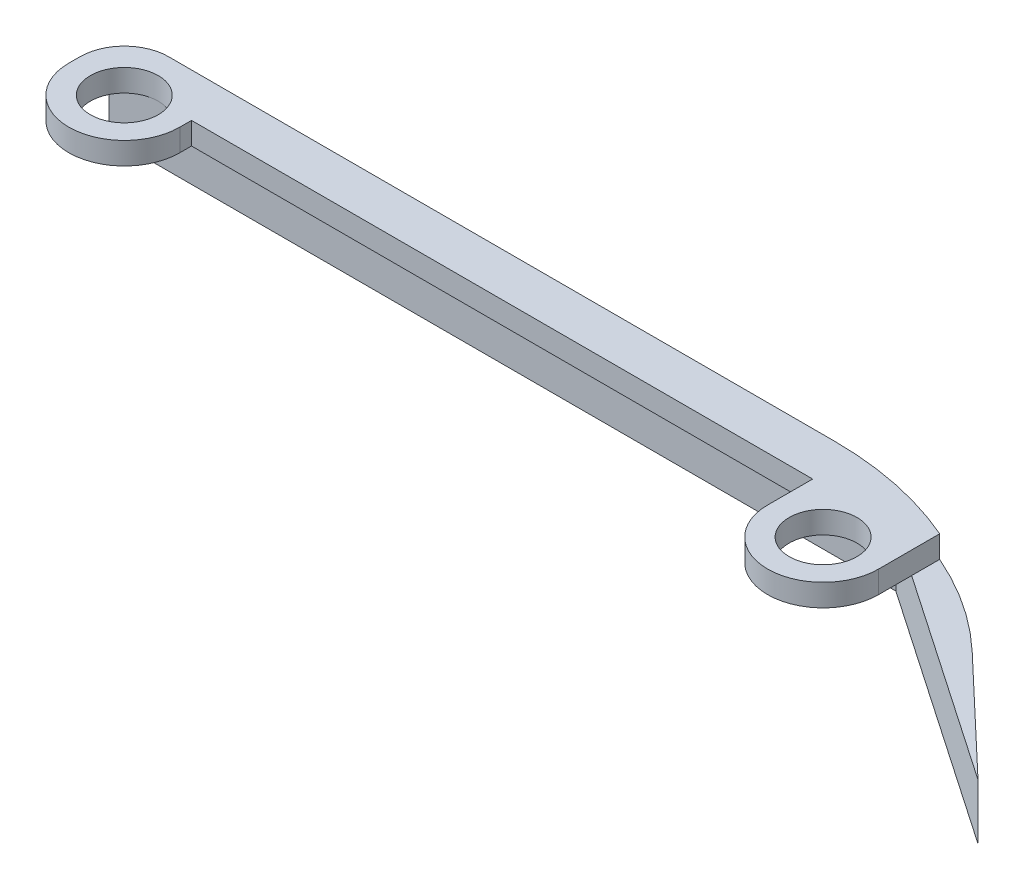
ISO-10303-21;
HEADER;
FILE_DESCRIPTION(('STEP AP214'),'2;1');
FILE_NAME('part.step','',(''),(''),'','','');
FILE_SCHEMA(('AUTOMOTIVE_DESIGN { 1 0 10303 214 1 1 1 1 }'));
ENDSEC;
DATA;
#1=APPLICATION_CONTEXT('core data for automotive mechanical design processes');
#2=APPLICATION_PROTOCOL_DEFINITION('international standard','automotive_design',2000,#1);
#3=PRODUCT_CONTEXT('',#1,'mechanical');
#4=PRODUCT('Part','Part','',(#3));
#5=PRODUCT_RELATED_PRODUCT_CATEGORY('part','',(#4));
#6=PRODUCT_DEFINITION_FORMATION('','',#4);
#7=PRODUCT_DEFINITION_CONTEXT('part definition',#1,'design');
#8=PRODUCT_DEFINITION('design','',#6,#7);
#9=PRODUCT_DEFINITION_SHAPE('','',#8);
#10=(LENGTH_UNIT() NAMED_UNIT(*) SI_UNIT(.MILLI.,.METRE.));
#11=(NAMED_UNIT(*) PLANE_ANGLE_UNIT() SI_UNIT($,.RADIAN.));
#12=(NAMED_UNIT(*) SI_UNIT($,.STERADIAN.) SOLID_ANGLE_UNIT());
#13=UNCERTAINTY_MEASURE_WITH_UNIT(LENGTH_MEASURE(1.E-05),#10,'distance_accuracy_value','');
#14=(GEOMETRIC_REPRESENTATION_CONTEXT(3) GLOBAL_UNCERTAINTY_ASSIGNED_CONTEXT((#13)) GLOBAL_UNIT_ASSIGNED_CONTEXT((#10,
#11,#12)) REPRESENTATION_CONTEXT('',''));
#15=CARTESIAN_POINT('',(0.,0.,0.));
#16=DIRECTION('',(0.,0.,1.));
#17=DIRECTION('',(1.,0.,0.));
#18=AXIS2_PLACEMENT_3D('',#15,#16,#17);
#19=CARTESIAN_POINT('',(-1.,2.,-1.));
#20=DIRECTION('',(0.,1.,0.));
#21=DIRECTION('',(0.,0.,1.));
#22=AXIS2_PLACEMENT_3D('',#19,#20,#21);
#23=CYLINDRICAL_SURFACE('',#22,4.);
#24=DIRECTION('',(0.,1.,0.));
#25=VECTOR('',#24,1.);
#26=CARTESIAN_POINT('',(-1.,2.,-5.));
#27=LINE('',#26,#25);
#28=CARTESIAN_POINT('',(-1.,-5.,-5.));
#29=VERTEX_POINT('',#28);
#30=CARTESIAN_POINT('',(-1.,2.,-5.));
#31=VERTEX_POINT('',#30);
#32=EDGE_CURVE('E257',#29,#31,#27,.T.);
#33=ORIENTED_EDGE('',*,*,#32,.F.);
#34=CARTESIAN_POINT('',(-1.,-5.,-1.));
#35=DIRECTION('',(0.,-1.,0.));
#36=DIRECTION('',(0.,0.,-1.));
#37=AXIS2_PLACEMENT_3D('',#34,#35,#36);
#38=CIRCLE('',#37,4.);
#39=CARTESIAN_POINT('',(-4.42876070906093,-5.,-3.06));
#40=VERTEX_POINT('',#39);
#41=EDGE_CURVE('E42',#40,#29,#38,.T.);
#42=ORIENTED_EDGE('',*,*,#41,.F.);
#43=DIRECTION('',(0.,1.,0.));
#44=VECTOR('',#43,1.);
#45=CARTESIAN_POINT('',(-4.42876070906093,2.,-3.06));
#46=LINE('',#45,#44);
#47=CARTESIAN_POINT('',(-4.42876070906093,0.,-3.06));
#48=VERTEX_POINT('',#47);
#49=EDGE_CURVE('E52',#48,#40,#46,.F.);
#50=ORIENTED_EDGE('',*,*,#49,.F.);
#51=CARTESIAN_POINT('',(-1.,0.,-1.));
#52=DIRECTION('',(0.,1.,0.));
#53=DIRECTION('',(0.,0.,1.));
#54=AXIS2_PLACEMENT_3D('',#51,#52,#53);
#55=CIRCLE('',#54,4.);
#56=CARTESIAN_POINT('',(-5.,0.,-1.));
#57=VERTEX_POINT('',#56);
#58=EDGE_CURVE('E263',#57,#48,#55,.F.);
#59=ORIENTED_EDGE('',*,*,#58,.F.);
#60=DIRECTION('',(0.,1.,0.));
#61=VECTOR('',#60,1.);
#62=CARTESIAN_POINT('',(-5.,2.,-1.));
#63=LINE('',#62,#61);
#64=CARTESIAN_POINT('',(-5.,2.,-1.));
#65=VERTEX_POINT('',#64);
#66=EDGE_CURVE('E260',#65,#57,#63,.F.);
#67=ORIENTED_EDGE('',*,*,#66,.F.);
#68=CARTESIAN_POINT('',(-1.,2.,-1.));
#69=DIRECTION('',(0.,1.,0.));
#70=DIRECTION('',(0.,0.,1.));
#71=AXIS2_PLACEMENT_3D('',#68,#69,#70);
#72=CIRCLE('',#71,4.);
#73=EDGE_CURVE('E11',#31,#65,#72,.T.);
#74=ORIENTED_EDGE('',*,*,#73,.F.);
#75=EDGE_LOOP('',(#33,#42,#50,#59,#67,#74));
#76=FACE_BOUND('',#75,.T.);
#77=ADVANCED_FACE('F35',(#76),#23,.T.);
#78=CARTESIAN_POINT('',(59.030327127602,-5.,25.));
#79=DIRECTION('',(0.,1.,0.));
#80=DIRECTION('',(0.,0.,1.));
#81=AXIS2_PLACEMENT_3D('',#78,#79,#80);
#82=CYLINDRICAL_SURFACE('',#81,30.);
#83=DIRECTION('',(0.,1.,0.));
#84=VECTOR('',#83,1.);
#85=CARTESIAN_POINT('',(79.682073844056,-5.,3.23982174798584));
#86=LINE('',#85,#84);
#87=CARTESIAN_POINT('',(79.682073844056,-5.,3.23982174798584));
#88=VERTEX_POINT('',#87);
#89=CARTESIAN_POINT('',(79.682073844056,0.,3.23982174798584));
#90=VERTEX_POINT('',#89);
#91=EDGE_CURVE('E183',#88,#90,#86,.T.);
#92=ORIENTED_EDGE('',*,*,#91,.F.);
#93=CARTESIAN_POINT('',(59.030327127602,-5.,25.));
#94=DIRECTION('',(0.,-1.,0.));
#95=DIRECTION('',(0.,0.,-1.));
#96=AXIS2_PLACEMENT_3D('',#93,#94,#95);
#97=CIRCLE('',#96,30.);
#98=CARTESIAN_POINT('',(59.030327127602,-5.,-5.));
#99=VERTEX_POINT('',#98);
#100=EDGE_CURVE('E255',#99,#88,#97,.T.);
#101=ORIENTED_EDGE('',*,*,#100,.F.);
#102=DIRECTION('',(0.,1.,0.));
#103=VECTOR('',#102,1.);
#104=CARTESIAN_POINT('',(59.030327127602,2.,-5.));
#105=LINE('',#104,#103);
#106=CARTESIAN_POINT('',(59.030327127602,2.,-5.));
#107=VERTEX_POINT('',#106);
#108=EDGE_CURVE('E252',#107,#99,#105,.F.);
#109=ORIENTED_EDGE('',*,*,#108,.F.);
#110=CARTESIAN_POINT('',(59.030327127602,2.,25.));
#111=DIRECTION('',(0.,1.,0.));
#112=DIRECTION('',(0.,0.,1.));
#113=AXIS2_PLACEMENT_3D('',#110,#111,#112);
#114=CIRCLE('',#113,30.);
#115=CARTESIAN_POINT('',(71.,2.,-2.50867011194432));
#116=VERTEX_POINT('',#115);
#117=EDGE_CURVE('E249',#116,#107,#114,.T.);
#118=ORIENTED_EDGE('',*,*,#117,.F.);
#119=DIRECTION('',(0.,1.,0.));
#120=VECTOR('',#119,1.);
#121=CARTESIAN_POINT('',(71.,-5.,-2.50867011194431));
#122=LINE('',#121,#120);
#123=CARTESIAN_POINT('',(71.,0.,-2.50867011194431));
#124=VERTEX_POINT('',#123);
#125=EDGE_CURVE('E246',#124,#116,#122,.T.);
#126=ORIENTED_EDGE('',*,*,#125,.F.);
#127=CARTESIAN_POINT('',(59.030327127602,0.,25.));
#128=DIRECTION('',(0.,-1.,0.));
#129=DIRECTION('',(0.,0.,-1.));
#130=AXIS2_PLACEMENT_3D('',#127,#128,#129);
#131=CIRCLE('',#130,30.);
#132=EDGE_CURVE('E243',#90,#124,#131,.F.);
#133=ORIENTED_EDGE('',*,*,#132,.F.);
#134=EDGE_LOOP('',(#92,#101,#109,#118,#126,#133));
#135=FACE_BOUND('',#134,.T.);
#136=ADVANCED_FACE('F276',(#135),#82,.T.);
#137=CARTESIAN_POINT('',(5.,2.,-3.06));
#138=DIRECTION('',(0.,0.,-1.));
#139=DIRECTION('',(-1.,0.,0.));
#140=AXIS2_PLACEMENT_3D('',#137,#138,#139);
#141=PLANE('',#140);
#142=DIRECTION('',(-1.,0.,0.));
#143=VECTOR('',#142,1.);
#144=CARTESIAN_POINT('',(66.5,0.,-3.06));
#145=LINE('',#144,#143);
#146=CARTESIAN_POINT('',(0.,0.,-3.06));
#147=VERTEX_POINT('',#146);
#148=EDGE_CURVE('E184',#147,#48,#145,.T.);
#149=ORIENTED_EDGE('',*,*,#148,.T.);
#150=ORIENTED_EDGE('',*,*,#49,.T.);
#151=DIRECTION('',(-1.,0.,0.));
#152=VECTOR('',#151,1.);
#153=CARTESIAN_POINT('',(66.5,-5.,-3.06));
#154=LINE('',#153,#152);
#155=CARTESIAN_POINT('',(66.5,-5.,-3.06));
#156=VERTEX_POINT('',#155);
#157=EDGE_CURVE('E173',#156,#40,#154,.T.);
#158=ORIENTED_EDGE('',*,*,#157,.F.);
#159=DIRECTION('',(0.,1.,0.));
#160=VECTOR('',#159,1.);
#161=CARTESIAN_POINT('',(66.5,-5.,-3.06));
#162=LINE('',#161,#160);
#163=CARTESIAN_POINT('',(66.5,0.,-3.06));
#164=VERTEX_POINT('',#163);
#165=EDGE_CURVE('E175',#156,#164,#162,.T.);
#166=ORIENTED_EDGE('',*,*,#165,.T.);
#167=EDGE_CURVE('E180',#164,#147,#145,.T.);
#168=ORIENTED_EDGE('',*,*,#167,.T.);
#169=EDGE_LOOP('',(#149,#150,#158,#166,#168));
#170=FACE_BOUND('',#169,.T.);
#171=ADVANCED_FACE('F302',(#170),#141,.F.);
#172=CARTESIAN_POINT('',(0.,0.,0.));
#173=DIRECTION('',(0.,1.,0.));
#174=DIRECTION('',(0.,0.,1.));
#175=AXIS2_PLACEMENT_3D('',#172,#173,#174);
#176=PLANE('',#175);
#177=CARTESIAN_POINT('',(66.,0.,3.));
#178=DIRECTION('',(0.,1.,0.));
#179=DIRECTION('',(0.,0.,1.));
#180=AXIS2_PLACEMENT_3D('',#177,#178,#179);
#181=CIRCLE('',#180,3.06);
#182=CARTESIAN_POINT('',(66.,0.,6.06));
#183=VERTEX_POINT('',#182);
#184=EDGE_CURVE('E190',#183,#183,#181,.T.);
#185=ORIENTED_EDGE('',*,*,#184,.T.);
#186=EDGE_LOOP('',(#185));
#187=FACE_BOUND('',#186,.T.);
#188=DIRECTION('',(0.,0.,1.));
#189=VECTOR('',#188,1.);
#190=CARTESIAN_POINT('',(-5.,0.,0.));
#191=LINE('',#190,#189);
#192=CARTESIAN_POINT('',(-5.,0.,0.));
#193=VERTEX_POINT('',#192);
#194=EDGE_CURVE('E207',#57,#193,#191,.T.);
#195=ORIENTED_EDGE('',*,*,#194,.F.);
#196=ORIENTED_EDGE('',*,*,#58,.T.);
#197=ORIENTED_EDGE('',*,*,#148,.F.);
#198=CARTESIAN_POINT('',(0.,0.,0.));
#199=DIRECTION('',(0.,1.,0.));
#200=DIRECTION('',(0.,0.,1.));
#201=AXIS2_PLACEMENT_3D('',#198,#199,#200);
#202=CIRCLE('',#201,3.06);
#203=EDGE_CURVE('E194',#147,#147,#202,.T.);
#204=ORIENTED_EDGE('',*,*,#203,.T.);
#205=ORIENTED_EDGE('',*,*,#167,.F.);
#206=DIRECTION('',(-0.825380372116216,0.,-0.564577046403143));
#207=VECTOR('',#206,1.);
#208=CARTESIAN_POINT('',(89.9332649686347,0.,12.968832245736));
#209=LINE('',#208,#207);
#210=CARTESIAN_POINT('',(71.,0.,0.0180919860018455));
#211=VERTEX_POINT('',#210);
#212=EDGE_CURVE('E179',#211,#164,#209,.T.);
#213=ORIENTED_EDGE('',*,*,#212,.F.);
#214=DIRECTION('',(0.,0.,-1.));
#215=VECTOR('',#214,1.);
#216=CARTESIAN_POINT('',(71.,0.,3.));
#217=LINE('',#216,#215);
#218=CARTESIAN_POINT('',(71.,0.,3.));
#219=VERTEX_POINT('',#218);
#220=EDGE_CURVE('E227',#219,#211,#217,.T.);
#221=ORIENTED_EDGE('',*,*,#220,.F.);
#222=CARTESIAN_POINT('',(66.,0.,3.));
#223=DIRECTION('',(0.,1.,0.));
#224=DIRECTION('',(0.,0.,1.));
#225=AXIS2_PLACEMENT_3D('',#222,#223,#224);
#226=CIRCLE('',#225,5.);
#227=CARTESIAN_POINT('',(61.,0.,3.));
#228=VERTEX_POINT('',#227);
#229=EDGE_CURVE('E145',#228,#219,#226,.T.);
#230=ORIENTED_EDGE('',*,*,#229,.F.);
#231=DIRECTION('',(0.,0.,1.));
#232=VECTOR('',#231,1.);
#233=CARTESIAN_POINT('',(61.,0.,3.));
#234=LINE('',#233,#232);
#235=CARTESIAN_POINT('',(61.,0.,-1.06));
#236=VERTEX_POINT('',#235);
#237=EDGE_CURVE('E137',#236,#228,#234,.T.);
#238=ORIENTED_EDGE('',*,*,#237,.F.);
#239=DIRECTION('',(-1.,0.,0.));
#240=VECTOR('',#239,1.);
#241=CARTESIAN_POINT('',(5.,0.,-1.06));
#242=LINE('',#241,#240);
#243=CARTESIAN_POINT('',(5.,0.,-1.06));
#244=VERTEX_POINT('',#243);
#245=EDGE_CURVE('E142',#236,#244,#242,.T.);
#246=ORIENTED_EDGE('',*,*,#245,.T.);
#247=DIRECTION('',(0.,0.,-1.));
#248=VECTOR('',#247,1.);
#249=CARTESIAN_POINT('',(5.,0.,0.));
#250=LINE('',#249,#248);
#251=CARTESIAN_POINT('',(5.,0.,0.));
#252=VERTEX_POINT('',#251);
#253=EDGE_CURVE('E149',#252,#244,#250,.T.);
#254=ORIENTED_EDGE('',*,*,#253,.F.);
#255=CARTESIAN_POINT('',(0.,0.,0.));
#256=DIRECTION('',(0.,1.,0.));
#257=DIRECTION('',(0.,0.,1.));
#258=AXIS2_PLACEMENT_3D('',#255,#256,#257);
#259=CIRCLE('',#258,5.);
#260=EDGE_CURVE('E200',#193,#252,#259,.T.);
#261=ORIENTED_EDGE('',*,*,#260,.F.);
#262=EDGE_LOOP('',(#195,#196,#197,#204,#205,#213,#221,#230,#238,#246,#254,#261));
#263=FACE_BOUND('',#262,.T.);
#264=ADVANCED_FACE('F140',(#187,#263),#176,.F.);
#265=CARTESIAN_POINT('',(0.,2.,0.));
#266=DIRECTION('',(0.,1.,0.));
#267=DIRECTION('',(0.,0.,1.));
#268=AXIS2_PLACEMENT_3D('',#265,#266,#267);
#269=PLANE('',#268);
#270=DIRECTION('',(-1.,0.,0.));
#271=VECTOR('',#270,1.);
#272=CARTESIAN_POINT('',(-5.,2.,-5.));
#273=LINE('',#272,#271);
#274=EDGE_CURVE('E216',#107,#31,#273,.T.);
#275=ORIENTED_EDGE('',*,*,#274,.T.);
#276=ORIENTED_EDGE('',*,*,#73,.T.);
#277=DIRECTION('',(0.,0.,1.));
#278=VECTOR('',#277,1.);
#279=CARTESIAN_POINT('',(-5.,2.,0.));
#280=LINE('',#279,#278);
#281=CARTESIAN_POINT('',(-5.,2.,0.));
#282=VERTEX_POINT('',#281);
#283=EDGE_CURVE('E219',#65,#282,#280,.T.);
#284=ORIENTED_EDGE('',*,*,#283,.T.);
#285=CARTESIAN_POINT('',(0.,2.,0.));
#286=DIRECTION('',(0.,1.,0.));
#287=DIRECTION('',(0.,0.,1.));
#288=AXIS2_PLACEMENT_3D('',#285,#286,#287);
#289=CIRCLE('',#288,5.);
#290=CARTESIAN_POINT('',(5.,2.,0.));
#291=VERTEX_POINT('',#290);
#292=EDGE_CURVE('E203',#282,#291,#289,.T.);
#293=ORIENTED_EDGE('',*,*,#292,.T.);
#294=DIRECTION('',(0.,0.,-1.));
#295=VECTOR('',#294,1.);
#296=CARTESIAN_POINT('',(5.,2.,0.));
#297=LINE('',#296,#295);
#298=CARTESIAN_POINT('',(5.,2.,-1.06));
#299=VERTEX_POINT('',#298);
#300=EDGE_CURVE('E206',#291,#299,#297,.T.);
#301=ORIENTED_EDGE('',*,*,#300,.T.);
#302=DIRECTION('',(1.,0.,0.));
#303=VECTOR('',#302,1.);
#304=CARTESIAN_POINT('',(5.,2.,-1.06));
#305=LINE('',#304,#303);
#306=CARTESIAN_POINT('',(61.,2.,-1.06));
#307=VERTEX_POINT('',#306);
#308=EDGE_CURVE('E315',#299,#307,#305,.T.);
#309=ORIENTED_EDGE('',*,*,#308,.T.);
#310=DIRECTION('',(0.,0.,1.));
#311=VECTOR('',#310,1.);
#312=CARTESIAN_POINT('',(61.,2.,3.));
#313=LINE('',#312,#311);
#314=CARTESIAN_POINT('',(61.,2.,3.));
#315=VERTEX_POINT('',#314);
#316=EDGE_CURVE('E154',#307,#315,#313,.T.);
#317=ORIENTED_EDGE('',*,*,#316,.T.);
#318=CARTESIAN_POINT('',(66.,2.,3.));
#319=DIRECTION('',(0.,1.,0.));
#320=DIRECTION('',(0.,0.,1.));
#321=AXIS2_PLACEMENT_3D('',#318,#319,#320);
#322=CIRCLE('',#321,5.);
#323=CARTESIAN_POINT('',(71.,2.,3.));
#324=VERTEX_POINT('',#323);
#325=EDGE_CURVE('E211',#315,#324,#322,.T.);
#326=ORIENTED_EDGE('',*,*,#325,.T.);
#327=DIRECTION('',(0.,0.,-1.));
#328=VECTOR('',#327,1.);
#329=CARTESIAN_POINT('',(71.,2.,3.));
#330=LINE('',#329,#328);
#331=EDGE_CURVE('E213',#324,#116,#330,.T.);
#332=ORIENTED_EDGE('',*,*,#331,.T.);
#333=ORIENTED_EDGE('',*,*,#117,.T.);
#334=EDGE_LOOP('',(#275,#276,#284,#293,#301,#309,#317,#326,#332,#333));
#335=FACE_BOUND('',#334,.T.);
#336=CARTESIAN_POINT('',(0.,2.,0.));
#337=DIRECTION('',(0.,1.,0.));
#338=DIRECTION('',(0.,0.,1.));
#339=AXIS2_PLACEMENT_3D('',#336,#337,#338);
#340=CIRCLE('',#339,3.06);
#341=CARTESIAN_POINT('',(0.,2.,3.06));
#342=VERTEX_POINT('',#341);
#343=EDGE_CURVE('E197',#342,#342,#340,.T.);
#344=ORIENTED_EDGE('',*,*,#343,.F.);
#345=EDGE_LOOP('',(#344));
#346=FACE_BOUND('',#345,.T.);
#347=CARTESIAN_POINT('',(66.,2.,3.));
#348=DIRECTION('',(0.,1.,0.));
#349=DIRECTION('',(0.,0.,1.));
#350=AXIS2_PLACEMENT_3D('',#347,#348,#349);
#351=CIRCLE('',#350,3.06);
#352=CARTESIAN_POINT('',(66.,2.,6.06));
#353=VERTEX_POINT('',#352);
#354=EDGE_CURVE('E191',#353,#353,#351,.T.);
#355=ORIENTED_EDGE('',*,*,#354,.F.);
#356=EDGE_LOOP('',(#355));
#357=FACE_BOUND('',#356,.T.);
#358=ADVANCED_FACE('F278',(#335,#346,#357),#269,.T.);
#359=CARTESIAN_POINT('',(0.,2.,0.));
#360=DIRECTION('',(0.,-1.,0.));
#361=DIRECTION('',(0.,0.,-1.));
#362=AXIS2_PLACEMENT_3D('',#359,#360,#361);
#363=CYLINDRICAL_SURFACE('',#362,5.);
#364=ORIENTED_EDGE('',*,*,#260,.T.);
#365=DIRECTION('',(0.,-1.,0.));
#366=VECTOR('',#365,1.);
#367=CARTESIAN_POINT('',(5.,2.,0.));
#368=LINE('',#367,#366);
#369=EDGE_CURVE('E238',#291,#252,#368,.T.);
#370=ORIENTED_EDGE('',*,*,#369,.F.);
#371=ORIENTED_EDGE('',*,*,#292,.F.);
#372=DIRECTION('',(0.,-1.,0.));
#373=VECTOR('',#372,1.);
#374=CARTESIAN_POINT('',(-5.,2.,0.));
#375=LINE('',#374,#373);
#376=EDGE_CURVE('E221',#282,#193,#375,.T.);
#377=ORIENTED_EDGE('',*,*,#376,.T.);
#378=EDGE_LOOP('',(#364,#370,#371,#377));
#379=FACE_BOUND('',#378,.T.);
#380=ADVANCED_FACE('F312',(#379),#363,.T.);
#381=CARTESIAN_POINT('',(5.,2.,0.));
#382=DIRECTION('',(-1.,0.,0.));
#383=DIRECTION('',(0.,0.,1.));
#384=AXIS2_PLACEMENT_3D('',#381,#382,#383);
#385=PLANE('',#384);
#386=ORIENTED_EDGE('',*,*,#253,.T.);
#387=DIRECTION('',(0.,1.,0.));
#388=VECTOR('',#387,1.);
#389=CARTESIAN_POINT('',(5.,-56.0357029044876,-1.06));
#390=LINE('',#389,#388);
#391=EDGE_CURVE('E158',#244,#299,#390,.T.);
#392=ORIENTED_EDGE('',*,*,#391,.T.);
#393=ORIENTED_EDGE('',*,*,#300,.F.);
#394=ORIENTED_EDGE('',*,*,#369,.T.);
#395=EDGE_LOOP('',(#386,#392,#393,#394));
#396=FACE_BOUND('',#395,.T.);
#397=ADVANCED_FACE('F314',(#396),#385,.F.);
#398=CARTESIAN_POINT('',(61.,2.,3.));
#399=DIRECTION('',(1.,0.,0.));
#400=DIRECTION('',(0.,0.,-1.));
#401=AXIS2_PLACEMENT_3D('',#398,#399,#400);
#402=PLANE('',#401);
#403=ORIENTED_EDGE('',*,*,#316,.F.);
#404=DIRECTION('',(0.,1.,0.));
#405=VECTOR('',#404,1.);
#406=CARTESIAN_POINT('',(61.,-56.0357029044876,-1.06));
#407=LINE('',#406,#405);
#408=EDGE_CURVE('E152',#236,#307,#407,.T.);
#409=ORIENTED_EDGE('',*,*,#408,.F.);
#410=ORIENTED_EDGE('',*,*,#237,.T.);
#411=DIRECTION('',(0.,-1.,0.));
#412=VECTOR('',#411,1.);
#413=CARTESIAN_POINT('',(61.,2.,3.));
#414=LINE('',#413,#412);
#415=EDGE_CURVE('E236',#315,#228,#414,.T.);
#416=ORIENTED_EDGE('',*,*,#415,.F.);
#417=EDGE_LOOP('',(#403,#409,#410,#416));
#418=FACE_BOUND('',#417,.T.);
#419=ADVANCED_FACE('F153',(#418),#402,.F.);
#420=CARTESIAN_POINT('',(66.,2.,3.));
#421=DIRECTION('',(0.,-1.,0.));
#422=DIRECTION('',(0.,0.,-1.));
#423=AXIS2_PLACEMENT_3D('',#420,#421,#422);
#424=CYLINDRICAL_SURFACE('',#423,5.);
#425=ORIENTED_EDGE('',*,*,#229,.T.);
#426=DIRECTION('',(0.,-1.,0.));
#427=VECTOR('',#426,1.);
#428=CARTESIAN_POINT('',(71.,2.,3.));
#429=LINE('',#428,#427);
#430=EDGE_CURVE('E233',#324,#219,#429,.T.);
#431=ORIENTED_EDGE('',*,*,#430,.F.);
#432=ORIENTED_EDGE('',*,*,#325,.F.);
#433=ORIENTED_EDGE('',*,*,#415,.T.);
#434=EDGE_LOOP('',(#425,#431,#432,#433));
#435=FACE_BOUND('',#434,.T.);
#436=ADVANCED_FACE('F318',(#435),#424,.T.);
#437=CARTESIAN_POINT('',(71.,2.,3.));
#438=DIRECTION('',(-1.,0.,0.));
#439=DIRECTION('',(0.,0.,1.));
#440=AXIS2_PLACEMENT_3D('',#437,#438,#439);
#441=PLANE('',#440);
#442=EDGE_CURVE('E226',#211,#124,#217,.T.);
#443=ORIENTED_EDGE('',*,*,#442,.T.);
#444=ORIENTED_EDGE('',*,*,#125,.T.);
#445=ORIENTED_EDGE('',*,*,#331,.F.);
#446=ORIENTED_EDGE('',*,*,#430,.T.);
#447=ORIENTED_EDGE('',*,*,#220,.T.);
#448=EDGE_LOOP('',(#443,#444,#445,#446,#447));
#449=FACE_BOUND('',#448,.T.);
#450=ADVANCED_FACE('F285',(#449),#441,.F.);
#451=CARTESIAN_POINT('',(-5.,2.,-5.));
#452=DIRECTION('',(0.,0.,1.));
#453=DIRECTION('',(1.,0.,0.));
#454=AXIS2_PLACEMENT_3D('',#451,#452,#453);
#455=PLANE('',#454);
#456=DIRECTION('',(1.,0.,0.));
#457=VECTOR('',#456,1.);
#458=CARTESIAN_POINT('',(-5.,-5.,-5.));
#459=LINE('',#458,#457);
#460=EDGE_CURVE('E167',#29,#99,#459,.T.);
#461=ORIENTED_EDGE('',*,*,#460,.F.);
#462=ORIENTED_EDGE('',*,*,#32,.T.);
#463=ORIENTED_EDGE('',*,*,#274,.F.);
#464=ORIENTED_EDGE('',*,*,#108,.T.);
#465=EDGE_LOOP('',(#461,#462,#463,#464));
#466=FACE_BOUND('',#465,.T.);
#467=ADVANCED_FACE('F273',(#466),#455,.F.);
#468=CARTESIAN_POINT('',(-5.,2.,0.));
#469=DIRECTION('',(1.,0.,0.));
#470=DIRECTION('',(0.,0.,-1.));
#471=AXIS2_PLACEMENT_3D('',#468,#469,#470);
#472=PLANE('',#471);
#473=ORIENTED_EDGE('',*,*,#283,.F.);
#474=ORIENTED_EDGE('',*,*,#66,.T.);
#475=ORIENTED_EDGE('',*,*,#194,.T.);
#476=ORIENTED_EDGE('',*,*,#376,.F.);
#477=EDGE_LOOP('',(#473,#474,#475,#476));
#478=FACE_BOUND('',#477,.T.);
#479=ADVANCED_FACE('F307',(#478),#472,.F.);
#480=CARTESIAN_POINT('',(0.,2.,0.));
#481=DIRECTION('',(0.,-1.,0.));
#482=DIRECTION('',(0.,0.,-1.));
#483=AXIS2_PLACEMENT_3D('',#480,#481,#482);
#484=CYLINDRICAL_SURFACE('',#483,3.06);
#485=ORIENTED_EDGE('',*,*,#343,.T.);
#486=EDGE_LOOP('',(#485));
#487=FACE_BOUND('',#486,.T.);
#488=ORIENTED_EDGE('',*,*,#203,.F.);
#489=EDGE_LOOP('',(#488));
#490=FACE_BOUND('',#489,.T.);
#491=ADVANCED_FACE('F437',(#487,#490),#484,.F.);
#492=CARTESIAN_POINT('',(66.,2.,3.));
#493=DIRECTION('',(0.,-1.,0.));
#494=DIRECTION('',(0.,0.,-1.));
#495=AXIS2_PLACEMENT_3D('',#492,#493,#494);
#496=CYLINDRICAL_SURFACE('',#495,3.06);
#497=ORIENTED_EDGE('',*,*,#354,.T.);
#498=EDGE_LOOP('',(#497));
#499=FACE_BOUND('',#498,.T.);
#500=ORIENTED_EDGE('',*,*,#184,.F.);
#501=EDGE_LOOP('',(#500));
#502=FACE_BOUND('',#501,.T.);
#503=ADVANCED_FACE('F382',(#499,#502),#496,.F.);
#504=CARTESIAN_POINT('',(71.,-5.,-5.));
#505=DIRECTION('',(-0.688391557215135,0.,0.725339275067139));
#506=DIRECTION('',(0.725339275067139,0.,0.688391557215135));
#507=AXIS2_PLACEMENT_3D('',#504,#505,#506);
#508=PLANE('',#507);
#509=DIRECTION('',(0.725339275067138,0.,0.688391557215134));
#510=VECTOR('',#509,1.);
#511=CARTESIAN_POINT('',(71.,-5.,-5.));
#512=LINE('',#511,#510);
#513=CARTESIAN_POINT('',(89.9332649686347,-5.,12.968832245736));
#514=VERTEX_POINT('',#513);
#515=EDGE_CURVE('E169',#88,#514,#512,.T.);
#516=ORIENTED_EDGE('',*,*,#515,.F.);
#517=ORIENTED_EDGE('',*,*,#91,.T.);
#518=DIRECTION('',(0.725339275067138,0.,0.688391557215134));
#519=VECTOR('',#518,1.);
#520=CARTESIAN_POINT('',(71.,0.,-5.));
#521=LINE('',#520,#519);
#522=CARTESIAN_POINT('',(89.9332649686347,0.,12.968832245736));
#523=VERTEX_POINT('',#522);
#524=EDGE_CURVE('E161',#90,#523,#521,.T.);
#525=ORIENTED_EDGE('',*,*,#524,.T.);
#526=DIRECTION('',(0.,1.,0.));
#527=VECTOR('',#526,1.);
#528=CARTESIAN_POINT('',(89.9332649686347,-5.,12.968832245736));
#529=LINE('',#528,#527);
#530=EDGE_CURVE('E187',#514,#523,#529,.T.);
#531=ORIENTED_EDGE('',*,*,#530,.F.);
#532=EDGE_LOOP('',(#516,#517,#525,#531));
#533=FACE_BOUND('',#532,.T.);
#534=ADVANCED_FACE('F294',(#533),#508,.F.);
#535=CARTESIAN_POINT('',(89.9332649686347,-5.,12.968832245736));
#536=DIRECTION('',(0.564577046403143,0.,-0.825380372116216));
#537=DIRECTION('',(-0.825380372116216,0.,-0.564577046403143));
#538=AXIS2_PLACEMENT_3D('',#535,#536,#537);
#539=PLANE('',#538);
#540=EDGE_CURVE('E163',#523,#211,#209,.T.);
#541=ORIENTED_EDGE('',*,*,#540,.T.);
#542=ORIENTED_EDGE('',*,*,#212,.T.);
#543=ORIENTED_EDGE('',*,*,#165,.F.);
#544=DIRECTION('',(-0.825380372116216,0.,-0.564577046403143));
#545=VECTOR('',#544,1.);
#546=CARTESIAN_POINT('',(89.9332649686347,-5.,12.968832245736));
#547=LINE('',#546,#545);
#548=EDGE_CURVE('E171',#514,#156,#547,.T.);
#549=ORIENTED_EDGE('',*,*,#548,.F.);
#550=ORIENTED_EDGE('',*,*,#530,.T.);
#551=EDGE_LOOP('',(#541,#542,#543,#549,#550));
#552=FACE_BOUND('',#551,.T.);
#553=ADVANCED_FACE('F297',(#552),#539,.F.);
#554=CARTESIAN_POINT('',(0.,-5.,0.));
#555=DIRECTION('',(0.,-1.,0.));
#556=DIRECTION('',(0.,0.,-1.));
#557=AXIS2_PLACEMENT_3D('',#554,#555,#556);
#558=PLANE('',#557);
#559=ORIENTED_EDGE('',*,*,#157,.T.);
#560=ORIENTED_EDGE('',*,*,#41,.T.);
#561=ORIENTED_EDGE('',*,*,#460,.T.);
#562=ORIENTED_EDGE('',*,*,#100,.T.);
#563=ORIENTED_EDGE('',*,*,#515,.T.);
#564=ORIENTED_EDGE('',*,*,#548,.T.);
#565=EDGE_LOOP('',(#559,#560,#561,#562,#563,#564));
#566=FACE_BOUND('',#565,.T.);
#567=ADVANCED_FACE('F266',(#566),#558,.T.);
#568=CARTESIAN_POINT('',(0.,0.,0.));
#569=DIRECTION('',(0.,-1.,0.));
#570=DIRECTION('',(0.,0.,-1.));
#571=AXIS2_PLACEMENT_3D('',#568,#569,#570);
#572=PLANE('',#571);
#573=ORIENTED_EDGE('',*,*,#524,.F.);
#574=ORIENTED_EDGE('',*,*,#132,.T.);
#575=ORIENTED_EDGE('',*,*,#442,.F.);
#576=ORIENTED_EDGE('',*,*,#540,.F.);
#577=EDGE_LOOP('',(#573,#574,#575,#576));
#578=FACE_BOUND('',#577,.T.);
#579=ADVANCED_FACE('F289',(#578),#572,.F.);
#580=CARTESIAN_POINT('',(5.,-56.0357029044876,-1.06));
#581=DIRECTION('',(0.,0.,1.));
#582=DIRECTION('',(1.,0.,0.));
#583=AXIS2_PLACEMENT_3D('',#580,#581,#582);
#584=PLANE('',#583);
#585=ORIENTED_EDGE('',*,*,#245,.F.);
#586=ORIENTED_EDGE('',*,*,#408,.T.);
#587=ORIENTED_EDGE('',*,*,#308,.F.);
#588=ORIENTED_EDGE('',*,*,#391,.F.);
#589=EDGE_LOOP('',(#585,#586,#587,#588));
#590=FACE_BOUND('',#589,.T.);
#591=ADVANCED_FACE('F160',(#590),#584,.T.);
#592=CLOSED_SHELL('',(#77,#136,#171,#264,#358,#380,#397,#419,#436,#450,#467,#479,#491,#503,#534,
#553,#567,#579,#591));
#593=MANIFOLD_SOLID_BREP('B2',#592);
#594=ADVANCED_BREP_SHAPE_REPRESENTATION('',(#18,#593),#14);
#595=SHAPE_DEFINITION_REPRESENTATION(#9,#594);
ENDSEC;
END-ISO-10303-21;
